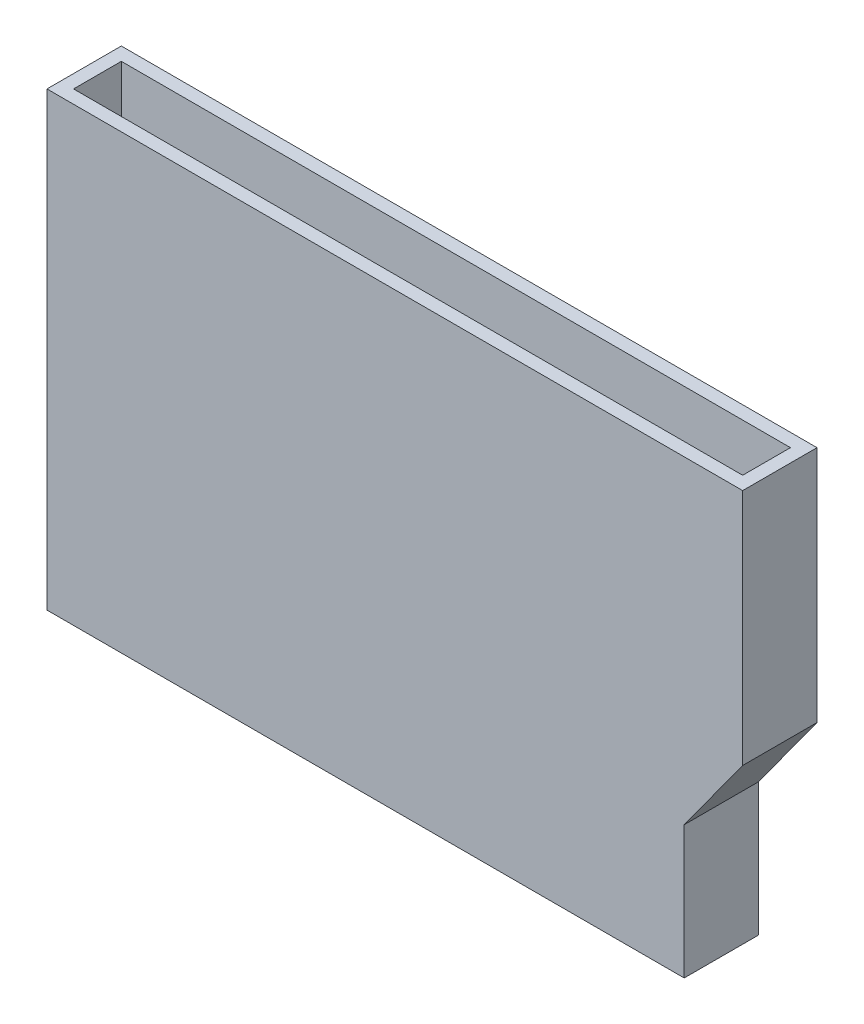
ISO-10303-21;
HEADER;
FILE_DESCRIPTION(('STEP AP214'),'2;1');
FILE_NAME('part.step','',(''),(''),'','','');
FILE_SCHEMA(('AUTOMOTIVE_DESIGN { 1 0 10303 214 1 1 1 1 }'));
ENDSEC;
DATA;
#1=APPLICATION_CONTEXT('core data for automotive mechanical design processes');
#2=APPLICATION_PROTOCOL_DEFINITION('international standard','automotive_design',2000,#1);
#3=PRODUCT_CONTEXT('',#1,'mechanical');
#4=PRODUCT('Part','Part','',(#3));
#5=PRODUCT_RELATED_PRODUCT_CATEGORY('part','',(#4));
#6=PRODUCT_DEFINITION_FORMATION('','',#4);
#7=PRODUCT_DEFINITION_CONTEXT('part definition',#1,'design');
#8=PRODUCT_DEFINITION('design','',#6,#7);
#9=PRODUCT_DEFINITION_SHAPE('','',#8);
#10=(LENGTH_UNIT() NAMED_UNIT(*) SI_UNIT(.MILLI.,.METRE.));
#11=(NAMED_UNIT(*) PLANE_ANGLE_UNIT() SI_UNIT($,.RADIAN.));
#12=(NAMED_UNIT(*) SI_UNIT($,.STERADIAN.) SOLID_ANGLE_UNIT());
#13=UNCERTAINTY_MEASURE_WITH_UNIT(LENGTH_MEASURE(1.E-05),#10,'distance_accuracy_value','');
#14=(GEOMETRIC_REPRESENTATION_CONTEXT(3) GLOBAL_UNCERTAINTY_ASSIGNED_CONTEXT((#13)) GLOBAL_UNIT_ASSIGNED_CONTEXT((#10,
#11,#12)) REPRESENTATION_CONTEXT('',''));
#15=CARTESIAN_POINT('',(0.,0.,0.));
#16=DIRECTION('',(0.,0.,1.));
#17=DIRECTION('',(1.,0.,0.));
#18=AXIS2_PLACEMENT_3D('',#15,#16,#17);
#19=CARTESIAN_POINT('',(11.2652767134552,13.4740938109529,-2.8));
#20=DIRECTION('',(0.,0.,-1.));
#21=DIRECTION('',(0.,-1.,0.));
#22=AXIS2_PLACEMENT_3D('',#19,#20,#21);
#23=PLANE('',#22);
#24=DIRECTION('',(0.,1.,0.));
#25=VECTOR('',#24,1.);
#26=CARTESIAN_POINT('',(-1.83596173891252,21.9740938109529,-2.8));
#27=LINE('',#26,#25);
#28=CARTESIAN_POINT('',(-1.83596173891252,4.97409381095289,-2.8));
#29=VERTEX_POINT('',#28);
#30=CARTESIAN_POINT('',(-1.83596173891252,21.9740938109529,-2.8));
#31=VERTEX_POINT('',#30);
#32=EDGE_CURVE('E11',#29,#31,#27,.T.);
#33=ORIENTED_EDGE('',*,*,#32,.T.);
#34=DIRECTION('',(1.,0.,0.));
#35=VECTOR('',#34,1.);
#36=CARTESIAN_POINT('',(-25.7259617389125,21.9740938109529,-2.8));
#37=LINE('',#36,#35);
#38=CARTESIAN_POINT('',(24.366515165823,21.9740938109529,-2.8));
#39=VERTEX_POINT('',#38);
#40=EDGE_CURVE('E118',#31,#39,#37,.T.);
#41=ORIENTED_EDGE('',*,*,#40,.T.);
#42=DIRECTION('',(-0.000793283902979107,-0.999999685350275,0.));
#43=VECTOR('',#42,1.);
#44=CARTESIAN_POINT('',(24.3593961595726,13.0000001937151,-2.8));
#45=LINE('',#44,#43);
#46=CARTESIAN_POINT('',(24.3593961595726,13.0000001937151,-2.8));
#47=VERTEX_POINT('',#46);
#48=EDGE_CURVE('E126',#39,#47,#45,.T.);
#49=ORIENTED_EDGE('',*,*,#48,.T.);
#50=DIRECTION('',(-0.587243822995975,-0.809410089110008,0.));
#51=VECTOR('',#50,1.);
#52=CARTESIAN_POINT('',(22.1640382610875,9.97409381095289,-2.8));
#53=LINE('',#52,#51);
#54=CARTESIAN_POINT('',(22.1640382610875,9.97409381095289,-2.8));
#55=VERTEX_POINT('',#54);
#56=EDGE_CURVE('E20',#47,#55,#53,.T.);
#57=ORIENTED_EDGE('',*,*,#56,.T.);
#58=DIRECTION('',(0.,-1.,0.));
#59=VECTOR('',#58,1.);
#60=CARTESIAN_POINT('',(22.1640382610875,4.97409381095289,-2.8));
#61=LINE('',#60,#59);
#62=CARTESIAN_POINT('',(22.1640382610875,4.97409381095289,-2.8));
#63=VERTEX_POINT('',#62);
#64=EDGE_CURVE('E173',#55,#63,#61,.T.);
#65=ORIENTED_EDGE('',*,*,#64,.T.);
#66=DIRECTION('',(-1.,0.,0.));
#67=VECTOR('',#66,1.);
#68=CARTESIAN_POINT('',(-1.83596173891252,4.97409381095289,-2.8));
#69=LINE('',#68,#67);
#70=EDGE_CURVE('E186',#63,#29,#69,.T.);
#71=ORIENTED_EDGE('',*,*,#70,.T.);
#72=EDGE_LOOP('',(#33,#41,#49,#57,#65,#71));
#73=FACE_BOUND('',#72,.T.);
#74=ADVANCED_FACE('F16',(#73),#23,.T.);
#75=CARTESIAN_POINT('',(11.2652767134552,13.4740938109529,0.));
#76=DIRECTION('',(0.,0.,1.));
#77=DIRECTION('',(1.,0.,0.));
#78=AXIS2_PLACEMENT_3D('',#75,#76,#77);
#79=PLANE('',#78);
#80=DIRECTION('',(0.,-1.,0.));
#81=VECTOR('',#80,1.);
#82=CARTESIAN_POINT('',(-1.83596173891252,21.9740938109529,0.));
#83=LINE('',#82,#81);
#84=CARTESIAN_POINT('',(-1.83596173891252,21.9740938109529,0.));
#85=VERTEX_POINT('',#84);
#86=CARTESIAN_POINT('',(-1.83596173891252,4.97409381095289,0.));
#87=VERTEX_POINT('',#86);
#88=EDGE_CURVE('E27',#85,#87,#83,.T.);
#89=ORIENTED_EDGE('',*,*,#88,.T.);
#90=DIRECTION('',(1.,0.,0.));
#91=VECTOR('',#90,1.);
#92=CARTESIAN_POINT('',(-1.83596173891252,4.97409381095289,0.));
#93=LINE('',#92,#91);
#94=CARTESIAN_POINT('',(22.1640382610875,4.97409381095289,0.));
#95=VERTEX_POINT('',#94);
#96=EDGE_CURVE('E149',#87,#95,#93,.T.);
#97=ORIENTED_EDGE('',*,*,#96,.T.);
#98=DIRECTION('',(0.,1.,0.));
#99=VECTOR('',#98,1.);
#100=CARTESIAN_POINT('',(22.1640382610875,4.97409381095289,0.));
#101=LINE('',#100,#99);
#102=CARTESIAN_POINT('',(22.1640382610875,9.97409381095289,0.));
#103=VERTEX_POINT('',#102);
#104=EDGE_CURVE('E170',#95,#103,#101,.T.);
#105=ORIENTED_EDGE('',*,*,#104,.T.);
#106=DIRECTION('',(0.587243822995975,0.809410089110008,0.));
#107=VECTOR('',#106,1.);
#108=CARTESIAN_POINT('',(22.1640382610875,9.97409381095289,0.));
#109=LINE('',#108,#107);
#110=CARTESIAN_POINT('',(24.3593961595726,13.0000001937151,0.));
#111=VERTEX_POINT('',#110);
#112=EDGE_CURVE('E133',#103,#111,#109,.T.);
#113=ORIENTED_EDGE('',*,*,#112,.T.);
#114=DIRECTION('',(0.000793283902979107,0.999999685350275,0.));
#115=VECTOR('',#114,1.);
#116=CARTESIAN_POINT('',(24.3593961595726,13.0000001937151,0.));
#117=LINE('',#116,#115);
#118=CARTESIAN_POINT('',(24.366515165823,21.9740938109529,0.));
#119=VERTEX_POINT('',#118);
#120=EDGE_CURVE('E124',#111,#119,#117,.T.);
#121=ORIENTED_EDGE('',*,*,#120,.T.);
#122=DIRECTION('',(1.,0.,0.));
#123=VECTOR('',#122,1.);
#124=CARTESIAN_POINT('',(-25.7259617389125,21.9740938109529,0.));
#125=LINE('',#124,#123);
#126=EDGE_CURVE('E108',#85,#119,#125,.T.);
#127=ORIENTED_EDGE('',*,*,#126,.F.);
#128=EDGE_LOOP('',(#89,#97,#105,#113,#121,#127));
#129=FACE_BOUND('',#128,.T.);
#130=ADVANCED_FACE('F130',(#129),#79,.T.);
#131=CARTESIAN_POINT('',(-1.83596173891252,4.97409381095289,0.));
#132=DIRECTION('',(-1.,0.,0.));
#133=DIRECTION('',(0.,0.,1.));
#134=AXIS2_PLACEMENT_3D('',#131,#132,#133);
#135=PLANE('',#134);
#136=ORIENTED_EDGE('',*,*,#88,.F.);
#137=DIRECTION('',(0.,0.,-1.));
#138=VECTOR('',#137,1.);
#139=CARTESIAN_POINT('',(-1.83596173891252,21.9740938109529,0.));
#140=LINE('',#139,#138);
#141=EDGE_CURVE('E114',#85,#31,#140,.T.);
#142=ORIENTED_EDGE('',*,*,#141,.T.);
#143=ORIENTED_EDGE('',*,*,#32,.F.);
#144=DIRECTION('',(0.,0.,-1.));
#145=VECTOR('',#144,1.);
#146=CARTESIAN_POINT('',(-1.83596173891252,4.97409381095289,0.));
#147=LINE('',#146,#145);
#148=EDGE_CURVE('E153',#87,#29,#147,.T.);
#149=ORIENTED_EDGE('',*,*,#148,.F.);
#150=EDGE_LOOP('',(#136,#142,#143,#149));
#151=FACE_BOUND('',#150,.T.);
#152=ADVANCED_FACE('F425',(#151),#135,.T.);
#153=CARTESIAN_POINT('',(-1.83596173891252,21.9740938109529,0.));
#154=DIRECTION('',(0.,1.,0.));
#155=DIRECTION('',(1.,0.,0.));
#156=AXIS2_PLACEMENT_3D('',#153,#154,#155);
#157=PLANE('',#156);
#158=DIRECTION('',(-1.,0.,0.));
#159=VECTOR('',#158,1.);
#160=CARTESIAN_POINT('',(11.0152767134552,21.9740938109529,-0.5));
#161=LINE('',#160,#159);
#162=CARTESIAN_POINT('',(23.866515165823,21.9740938109529,-0.5));
#163=VERTEX_POINT('',#162);
#164=CARTESIAN_POINT('',(-1.33596173891252,21.9740938109529,-0.5));
#165=VERTEX_POINT('',#164);
#166=EDGE_CURVE('E161',#163,#165,#161,.T.);
#167=ORIENTED_EDGE('',*,*,#166,.T.);
#168=DIRECTION('',(0.,0.,-1.));
#169=VECTOR('',#168,1.);
#170=CARTESIAN_POINT('',(-1.33596173891252,21.9740938109529,-0.25));
#171=LINE('',#170,#169);
#172=CARTESIAN_POINT('',(-1.33596173891252,21.9740938109529,-2.3));
#173=VERTEX_POINT('',#172);
#174=EDGE_CURVE('E155',#165,#173,#171,.T.);
#175=ORIENTED_EDGE('',*,*,#174,.T.);
#176=DIRECTION('',(1.,0.,0.));
#177=VECTOR('',#176,1.);
#178=CARTESIAN_POINT('',(-1.58596173891252,21.9740938109529,-2.3));
#179=LINE('',#178,#177);
#180=CARTESIAN_POINT('',(23.866515165823,21.9740938109529,-2.3));
#181=VERTEX_POINT('',#180);
#182=EDGE_CURVE('E214',#173,#181,#179,.T.);
#183=ORIENTED_EDGE('',*,*,#182,.T.);
#184=DIRECTION('',(0.,0.,1.));
#185=VECTOR('',#184,1.);
#186=CARTESIAN_POINT('',(23.866515165823,21.9740938109529,-1.15));
#187=LINE('',#186,#185);
#188=EDGE_CURVE('E179',#181,#163,#187,.T.);
#189=ORIENTED_EDGE('',*,*,#188,.T.);
#190=EDGE_LOOP('',(#167,#175,#183,#189));
#191=FACE_BOUND('',#190,.T.);
#192=ORIENTED_EDGE('',*,*,#126,.T.);
#193=DIRECTION('',(0.,0.,-1.));
#194=VECTOR('',#193,1.);
#195=CARTESIAN_POINT('',(24.366515165823,21.9740938109529,0.));
#196=LINE('',#195,#194);
#197=EDGE_CURVE('E112',#119,#39,#196,.T.);
#198=ORIENTED_EDGE('',*,*,#197,.T.);
#199=ORIENTED_EDGE('',*,*,#40,.F.);
#200=ORIENTED_EDGE('',*,*,#141,.F.);
#201=EDGE_LOOP('',(#192,#198,#199,#200));
#202=FACE_BOUND('',#201,.T.);
#203=ADVANCED_FACE('F110',(#191,#202),#157,.T.);
#204=CARTESIAN_POINT('',(24.366515165823,21.9740938109529,0.));
#205=DIRECTION('',(0.999999685350275,-0.000793283902979107,0.));
#206=DIRECTION('',(0.,0.,-1.));
#207=AXIS2_PLACEMENT_3D('',#204,#205,#206);
#208=PLANE('',#207);
#209=ORIENTED_EDGE('',*,*,#120,.F.);
#210=DIRECTION('',(0.,0.,-1.));
#211=VECTOR('',#210,1.);
#212=CARTESIAN_POINT('',(24.3593961595726,13.0000001937151,0.));
#213=LINE('',#212,#211);
#214=EDGE_CURVE('E135',#111,#47,#213,.T.);
#215=ORIENTED_EDGE('',*,*,#214,.T.);
#216=ORIENTED_EDGE('',*,*,#48,.F.);
#217=ORIENTED_EDGE('',*,*,#197,.F.);
#218=EDGE_LOOP('',(#209,#215,#216,#217));
#219=FACE_BOUND('',#218,.T.);
#220=ADVANCED_FACE('F122',(#219),#208,.T.);
#221=CARTESIAN_POINT('',(24.3593961595726,13.0000001937151,0.));
#222=DIRECTION('',(0.809410089110008,-0.587243822995975,0.));
#223=DIRECTION('',(0.,0.,-1.));
#224=AXIS2_PLACEMENT_3D('',#221,#222,#223);
#225=PLANE('',#224);
#226=ORIENTED_EDGE('',*,*,#112,.F.);
#227=DIRECTION('',(0.,0.,-1.));
#228=VECTOR('',#227,1.);
#229=CARTESIAN_POINT('',(22.1640382610875,9.97409381095289,0.));
#230=LINE('',#229,#228);
#231=EDGE_CURVE('E175',#103,#55,#230,.T.);
#232=ORIENTED_EDGE('',*,*,#231,.T.);
#233=ORIENTED_EDGE('',*,*,#56,.F.);
#234=ORIENTED_EDGE('',*,*,#214,.F.);
#235=EDGE_LOOP('',(#226,#232,#233,#234));
#236=FACE_BOUND('',#235,.T.);
#237=ADVANCED_FACE('F398',(#236),#225,.T.);
#238=CARTESIAN_POINT('',(22.1640382610875,9.97409381095289,0.));
#239=DIRECTION('',(1.,0.,0.));
#240=DIRECTION('',(0.,1.,0.));
#241=AXIS2_PLACEMENT_3D('',#238,#239,#240);
#242=PLANE('',#241);
#243=ORIENTED_EDGE('',*,*,#104,.F.);
#244=DIRECTION('',(0.,0.,-1.));
#245=VECTOR('',#244,1.);
#246=CARTESIAN_POINT('',(22.1640382610875,4.97409381095289,0.));
#247=LINE('',#246,#245);
#248=EDGE_CURVE('E174',#95,#63,#247,.T.);
#249=ORIENTED_EDGE('',*,*,#248,.T.);
#250=ORIENTED_EDGE('',*,*,#64,.F.);
#251=ORIENTED_EDGE('',*,*,#231,.F.);
#252=EDGE_LOOP('',(#243,#249,#250,#251));
#253=FACE_BOUND('',#252,.T.);
#254=ADVANCED_FACE('F235',(#253),#242,.T.);
#255=CARTESIAN_POINT('',(22.1640382610875,4.97409381095289,0.));
#256=DIRECTION('',(0.,-1.,0.));
#257=DIRECTION('',(0.,0.,-1.));
#258=AXIS2_PLACEMENT_3D('',#255,#256,#257);
#259=PLANE('',#258);
#260=ORIENTED_EDGE('',*,*,#96,.F.);
#261=ORIENTED_EDGE('',*,*,#148,.T.);
#262=ORIENTED_EDGE('',*,*,#70,.F.);
#263=ORIENTED_EDGE('',*,*,#248,.F.);
#264=EDGE_LOOP('',(#260,#261,#262,#263));
#265=FACE_BOUND('',#264,.T.);
#266=ADVANCED_FACE('F238',(#265),#259,.T.);
#267=CARTESIAN_POINT('',(11.2652767134552,12.9740938109529,-1.4));
#268=DIRECTION('',(0.,-1.,0.));
#269=DIRECTION('',(0.,0.,-1.));
#270=AXIS2_PLACEMENT_3D('',#267,#268,#269);
#271=PLANE('',#270);
#272=DIRECTION('',(0.,0.,-1.));
#273=VECTOR('',#272,1.);
#274=CARTESIAN_POINT('',(-1.33596173891252,12.9740938109529,-2.3));
#275=LINE('',#274,#273);
#276=CARTESIAN_POINT('',(-1.33596173891252,12.9740938109529,-0.5));
#277=VERTEX_POINT('',#276);
#278=CARTESIAN_POINT('',(-1.33596173891252,12.9740938109529,-2.3));
#279=VERTEX_POINT('',#278);
#280=EDGE_CURVE('E154',#277,#279,#275,.T.);
#281=ORIENTED_EDGE('',*,*,#280,.F.);
#282=DIRECTION('',(-1.,0.,0.));
#283=VECTOR('',#282,1.);
#284=CARTESIAN_POINT('',(-1.33596173891252,12.9740938109529,-0.5));
#285=LINE('',#284,#283);
#286=CARTESIAN_POINT('',(23.866515165823,12.9740938109529,-0.5));
#287=VERTEX_POINT('',#286);
#288=EDGE_CURVE('E168',#287,#277,#285,.T.);
#289=ORIENTED_EDGE('',*,*,#288,.F.);
#290=DIRECTION('',(0.,0.,1.));
#291=VECTOR('',#290,1.);
#292=CARTESIAN_POINT('',(23.866515165823,12.9740938109529,-0.5));
#293=LINE('',#292,#291);
#294=CARTESIAN_POINT('',(23.866515165823,12.9740938109529,-2.3));
#295=VERTEX_POINT('',#294);
#296=EDGE_CURVE('E191',#295,#287,#293,.T.);
#297=ORIENTED_EDGE('',*,*,#296,.F.);
#298=DIRECTION('',(1.,0.,0.));
#299=VECTOR('',#298,1.);
#300=CARTESIAN_POINT('',(23.866515165823,12.9740938109529,-2.3));
#301=LINE('',#300,#299);
#302=EDGE_CURVE('E157',#279,#295,#301,.T.);
#303=ORIENTED_EDGE('',*,*,#302,.F.);
#304=EDGE_LOOP('',(#281,#289,#297,#303));
#305=FACE_BOUND('',#304,.T.);
#306=ADVANCED_FACE('F208',(#305),#271,.F.);
#307=CARTESIAN_POINT('',(-1.33596173891252,21.9740938109529,-0.5));
#308=DIRECTION('',(-1.,0.,0.));
#309=DIRECTION('',(0.,1.,0.));
#310=AXIS2_PLACEMENT_3D('',#307,#308,#309);
#311=PLANE('',#310);
#312=ORIENTED_EDGE('',*,*,#174,.F.);
#313=DIRECTION('',(0.,-1.,0.));
#314=VECTOR('',#313,1.);
#315=CARTESIAN_POINT('',(-1.33596173891252,21.9740938109529,-0.5));
#316=LINE('',#315,#314);
#317=EDGE_CURVE('E146',#165,#277,#316,.T.);
#318=ORIENTED_EDGE('',*,*,#317,.T.);
#319=ORIENTED_EDGE('',*,*,#280,.T.);
#320=DIRECTION('',(0.,-1.,0.));
#321=VECTOR('',#320,1.);
#322=CARTESIAN_POINT('',(-1.33596173891252,21.9740938109529,-2.3));
#323=LINE('',#322,#321);
#324=EDGE_CURVE('E201',#173,#279,#323,.T.);
#325=ORIENTED_EDGE('',*,*,#324,.F.);
#326=EDGE_LOOP('',(#312,#318,#319,#325));
#327=FACE_BOUND('',#326,.T.);
#328=ADVANCED_FACE('F199',(#327),#311,.F.);
#329=CARTESIAN_POINT('',(-1.33596173891252,21.9740938109529,-2.3));
#330=DIRECTION('',(0.,0.,-1.));
#331=DIRECTION('',(0.,-1.,0.));
#332=AXIS2_PLACEMENT_3D('',#329,#330,#331);
#333=PLANE('',#332);
#334=ORIENTED_EDGE('',*,*,#182,.F.);
#335=ORIENTED_EDGE('',*,*,#324,.T.);
#336=ORIENTED_EDGE('',*,*,#302,.T.);
#337=DIRECTION('',(0.,-1.,0.));
#338=VECTOR('',#337,1.);
#339=CARTESIAN_POINT('',(23.866515165823,21.9740938109529,-2.3));
#340=LINE('',#339,#338);
#341=EDGE_CURVE('E182',#181,#295,#340,.T.);
#342=ORIENTED_EDGE('',*,*,#341,.F.);
#343=EDGE_LOOP('',(#334,#335,#336,#342));
#344=FACE_BOUND('',#343,.T.);
#345=ADVANCED_FACE('F213',(#344),#333,.F.);
#346=CARTESIAN_POINT('',(23.866515165823,21.9740938109529,-2.3));
#347=DIRECTION('',(1.,0.,0.));
#348=DIRECTION('',(0.,1.,0.));
#349=AXIS2_PLACEMENT_3D('',#346,#347,#348);
#350=PLANE('',#349);
#351=ORIENTED_EDGE('',*,*,#188,.F.);
#352=ORIENTED_EDGE('',*,*,#341,.T.);
#353=ORIENTED_EDGE('',*,*,#296,.T.);
#354=DIRECTION('',(0.,-1.,0.));
#355=VECTOR('',#354,1.);
#356=CARTESIAN_POINT('',(23.866515165823,21.9740938109529,-0.5));
#357=LINE('',#356,#355);
#358=EDGE_CURVE('E165',#163,#287,#357,.T.);
#359=ORIENTED_EDGE('',*,*,#358,.F.);
#360=EDGE_LOOP('',(#351,#352,#353,#359));
#361=FACE_BOUND('',#360,.T.);
#362=ADVANCED_FACE('F18',(#361),#350,.F.);
#363=CARTESIAN_POINT('',(23.866515165823,21.9740938109529,-0.5));
#364=DIRECTION('',(0.,0.,1.));
#365=DIRECTION('',(1.,0.,0.));
#366=AXIS2_PLACEMENT_3D('',#363,#364,#365);
#367=PLANE('',#366);
#368=ORIENTED_EDGE('',*,*,#166,.F.);
#369=ORIENTED_EDGE('',*,*,#358,.T.);
#370=ORIENTED_EDGE('',*,*,#288,.T.);
#371=ORIENTED_EDGE('',*,*,#317,.F.);
#372=EDGE_LOOP('',(#368,#369,#370,#371));
#373=FACE_BOUND('',#372,.T.);
#374=ADVANCED_FACE('F333',(#373),#367,.F.);
#375=CLOSED_SHELL('',(#74,#130,#152,#203,#220,#237,#254,#266,#306,#328,#345,#362,#374));
#376=MANIFOLD_SOLID_BREP('B1',#375);
#377=ADVANCED_BREP_SHAPE_REPRESENTATION('',(#18,#376),#14);
#378=SHAPE_DEFINITION_REPRESENTATION(#9,#377);
ENDSEC;
END-ISO-10303-21;
